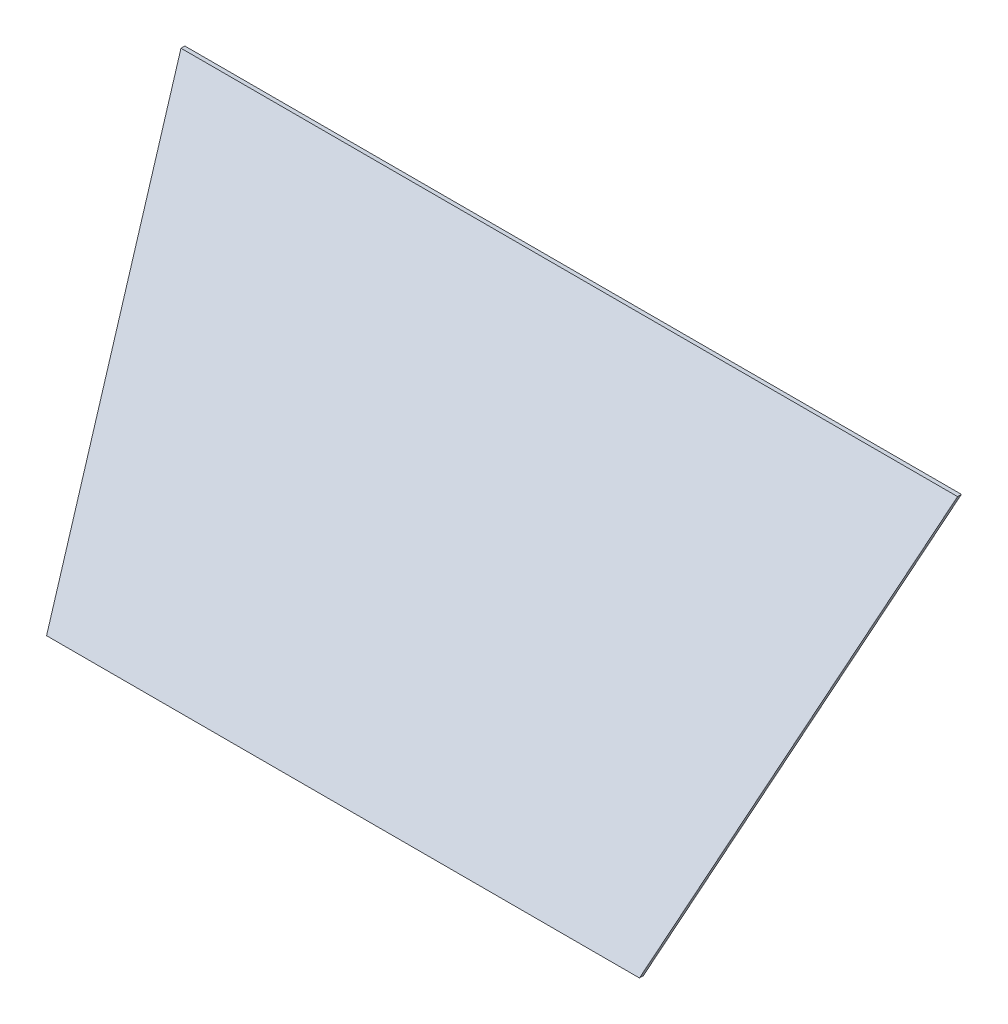
ISO-10303-21;
HEADER;
FILE_DESCRIPTION(('STEP AP214'),'2;1');
FILE_NAME('part.step','',(''),(''),'','','');
FILE_SCHEMA(('AUTOMOTIVE_DESIGN { 1 0 10303 214 1 1 1 1 }'));
ENDSEC;
DATA;
#1=APPLICATION_CONTEXT('core data for automotive mechanical design processes');
#2=APPLICATION_PROTOCOL_DEFINITION('international standard','automotive_design',2000,#1);
#3=PRODUCT_CONTEXT('',#1,'mechanical');
#4=PRODUCT('Part','Part','',(#3));
#5=PRODUCT_RELATED_PRODUCT_CATEGORY('part','',(#4));
#6=PRODUCT_DEFINITION_FORMATION('','',#4);
#7=PRODUCT_DEFINITION_CONTEXT('part definition',#1,'design');
#8=PRODUCT_DEFINITION('design','',#6,#7);
#9=PRODUCT_DEFINITION_SHAPE('','',#8);
#10=(LENGTH_UNIT() NAMED_UNIT(*) SI_UNIT(.MILLI.,.METRE.));
#11=(NAMED_UNIT(*) PLANE_ANGLE_UNIT() SI_UNIT($,.RADIAN.));
#12=(NAMED_UNIT(*) SI_UNIT($,.STERADIAN.) SOLID_ANGLE_UNIT());
#13=UNCERTAINTY_MEASURE_WITH_UNIT(LENGTH_MEASURE(1.E-05),#10,'distance_accuracy_value','');
#14=(GEOMETRIC_REPRESENTATION_CONTEXT(3) GLOBAL_UNCERTAINTY_ASSIGNED_CONTEXT((#13)) GLOBAL_UNIT_ASSIGNED_CONTEXT((#10,
#11,#12)) REPRESENTATION_CONTEXT('',''));
#15=CARTESIAN_POINT('',(0.,0.,0.));
#16=DIRECTION('',(0.,0.,1.));
#17=DIRECTION('',(1.,0.,0.));
#18=AXIS2_PLACEMENT_3D('',#15,#16,#17);
#19=CARTESIAN_POINT('',(0.,-529.718389738212,-815.684849984326));
#20=DIRECTION('',(0.,-0.543237640367641,-0.839578981447128));
#21=DIRECTION('',(0.,0.839578981447128,-0.543237640367641));
#22=AXIS2_PLACEMENT_3D('',#19,#20,#21);
#23=PLANE('',#22);
#24=DIRECTION('',(0.215350421936689,0.819879803707945,-0.530491567551749));
#25=VECTOR('',#24,1.);
#26=CARTESIAN_POINT('',(230.,94.9999999999997,-1219.9));
#27=LINE('',#26,#25);
#28=CARTESIAN_POINT('',(230.,94.9999999999997,-1219.9));
#29=VERTEX_POINT('',#28);
#30=CARTESIAN_POINT('',(301.265855838461,366.322597701217,-1395.45542838814));
#31=VERTEX_POINT('',#30);
#32=EDGE_CURVE('E95',#29,#31,#27,.T.);
#33=ORIENTED_EDGE('',*,*,#32,.T.);
#34=DIRECTION('',(1.,0.,0.));
#35=VECTOR('',#34,1.);
#36=CARTESIAN_POINT('',(-301.265855838461,366.322597701217,-1395.45542838814));
#37=LINE('',#36,#35);
#38=CARTESIAN_POINT('',(-301.265855838461,366.322597701217,-1395.45542838814));
#39=VERTEX_POINT('',#38);
#40=EDGE_CURVE('E101',#39,#31,#37,.T.);
#41=ORIENTED_EDGE('',*,*,#40,.F.);
#42=DIRECTION('',(-0.215350421936689,0.819879803707945,-0.530491567551749));
#43=VECTOR('',#42,1.);
#44=CARTESIAN_POINT('',(-230.,94.9999999999997,-1219.9));
#45=LINE('',#44,#43);
#46=CARTESIAN_POINT('',(-230.,94.9999999999997,-1219.9));
#47=VERTEX_POINT('',#46);
#48=EDGE_CURVE('E125',#47,#39,#45,.T.);
#49=ORIENTED_EDGE('',*,*,#48,.F.);
#50=DIRECTION('',(-1.,0.,0.));
#51=VECTOR('',#50,1.);
#52=CARTESIAN_POINT('',(230.,94.9999999999997,-1219.9));
#53=LINE('',#52,#51);
#54=EDGE_CURVE('E75',#29,#47,#53,.T.);
#55=ORIENTED_EDGE('',*,*,#54,.F.);
#56=EDGE_LOOP('',(#33,#41,#49,#55));
#57=FACE_BOUND('',#56,.T.);
#58=ADVANCED_FACE('F66',(#57),#23,.F.);
#59=CARTESIAN_POINT('',(0.,-529.718389738212,-818.684849984326));
#60=DIRECTION('',(0.,-0.543237640367641,-0.839578981447128));
#61=DIRECTION('',(0.,0.839578981447128,-0.543237640367641));
#62=AXIS2_PLACEMENT_3D('',#59,#60,#61);
#63=PLANE('',#62);
#64=DIRECTION('',(0.215350421936689,0.819879803707945,-0.530491567551749));
#65=VECTOR('',#64,1.);
#66=CARTESIAN_POINT('',(230.,94.9999999999997,-1222.9));
#67=LINE('',#66,#65);
#68=CARTESIAN_POINT('',(230.,94.9999999999997,-1222.9));
#69=VERTEX_POINT('',#68);
#70=CARTESIAN_POINT('',(301.265855838461,366.322597701217,-1398.45542838814));
#71=VERTEX_POINT('',#70);
#72=EDGE_CURVE('E83',#69,#71,#67,.T.);
#73=ORIENTED_EDGE('',*,*,#72,.F.);
#74=DIRECTION('',(-1.,0.,0.));
#75=VECTOR('',#74,1.);
#76=CARTESIAN_POINT('',(230.,94.9999999999997,-1222.9));
#77=LINE('',#76,#75);
#78=CARTESIAN_POINT('',(-230.,94.9999999999997,-1222.9));
#79=VERTEX_POINT('',#78);
#80=EDGE_CURVE('E12',#69,#79,#77,.T.);
#81=ORIENTED_EDGE('',*,*,#80,.T.);
#82=DIRECTION('',(-0.215350421936689,0.819879803707945,-0.530491567551749));
#83=VECTOR('',#82,1.);
#84=CARTESIAN_POINT('',(-230.,94.9999999999997,-1222.9));
#85=LINE('',#84,#83);
#86=CARTESIAN_POINT('',(-301.265855838461,366.322597701217,-1398.45542838814));
#87=VERTEX_POINT('',#86);
#88=EDGE_CURVE('E110',#79,#87,#85,.T.);
#89=ORIENTED_EDGE('',*,*,#88,.T.);
#90=DIRECTION('',(1.,0.,0.));
#91=VECTOR('',#90,1.);
#92=CARTESIAN_POINT('',(-301.265855838461,366.322597701217,-1398.45542838814));
#93=LINE('',#92,#91);
#94=EDGE_CURVE('E127',#87,#71,#93,.T.);
#95=ORIENTED_EDGE('',*,*,#94,.T.);
#96=EDGE_LOOP('',(#73,#81,#89,#95));
#97=FACE_BOUND('',#96,.T.);
#98=ADVANCED_FACE('F109',(#97),#63,.T.);
#99=CARTESIAN_POINT('',(230.,94.9999999999997,-1222.9));
#100=DIRECTION('',(0.967192721346285,-0.254043775311987,0.));
#101=DIRECTION('',(0.254043775311987,0.967192721346285,0.));
#102=AXIS2_PLACEMENT_3D('',#99,#100,#101);
#103=PLANE('',#102);
#104=ORIENTED_EDGE('',*,*,#32,.F.);
#105=DIRECTION('',(0.,0.,1.));
#106=VECTOR('',#105,1.);
#107=CARTESIAN_POINT('',(230.,94.9999999999997,-1222.9));
#108=LINE('',#107,#106);
#109=EDGE_CURVE('E138',#69,#29,#108,.T.);
#110=ORIENTED_EDGE('',*,*,#109,.F.);
#111=ORIENTED_EDGE('',*,*,#72,.T.);
#112=DIRECTION('',(0.,0.,1.));
#113=VECTOR('',#112,1.);
#114=CARTESIAN_POINT('',(301.265855838461,366.322597701217,-1398.45542838814));
#115=LINE('',#114,#113);
#116=EDGE_CURVE('E150',#71,#31,#115,.T.);
#117=ORIENTED_EDGE('',*,*,#116,.T.);
#118=EDGE_LOOP('',(#104,#110,#111,#117));
#119=FACE_BOUND('',#118,.T.);
#120=ADVANCED_FACE('F162',(#119),#103,.T.);
#121=CARTESIAN_POINT('',(230.,94.9999999999997,-1222.9));
#122=DIRECTION('',(0.,1.,0.));
#123=DIRECTION('',(0.,0.,1.));
#124=AXIS2_PLACEMENT_3D('',#121,#122,#123);
#125=PLANE('',#124);
#126=ORIENTED_EDGE('',*,*,#54,.T.);
#127=DIRECTION('',(0.,0.,1.));
#128=VECTOR('',#127,1.);
#129=CARTESIAN_POINT('',(-230.,94.9999999999997,-1222.9));
#130=LINE('',#129,#128);
#131=EDGE_CURVE('E120',#79,#47,#130,.T.);
#132=ORIENTED_EDGE('',*,*,#131,.F.);
#133=ORIENTED_EDGE('',*,*,#80,.F.);
#134=ORIENTED_EDGE('',*,*,#109,.T.);
#135=EDGE_LOOP('',(#126,#132,#133,#134));
#136=FACE_BOUND('',#135,.T.);
#137=ADVANCED_FACE('F124',(#136),#125,.F.);
#138=CARTESIAN_POINT('',(-230.,94.9999999999997,-1222.9));
#139=DIRECTION('',(0.967192721346285,0.254043775311987,0.));
#140=DIRECTION('',(-0.254043775311987,0.967192721346285,0.));
#141=AXIS2_PLACEMENT_3D('',#138,#139,#140);
#142=PLANE('',#141);
#143=ORIENTED_EDGE('',*,*,#48,.T.);
#144=DIRECTION('',(0.,0.,1.));
#145=VECTOR('',#144,1.);
#146=CARTESIAN_POINT('',(-301.265855838461,366.322597701217,-1398.45542838814));
#147=LINE('',#146,#145);
#148=EDGE_CURVE('E122',#87,#39,#147,.T.);
#149=ORIENTED_EDGE('',*,*,#148,.F.);
#150=ORIENTED_EDGE('',*,*,#88,.F.);
#151=ORIENTED_EDGE('',*,*,#131,.T.);
#152=EDGE_LOOP('',(#143,#149,#150,#151));
#153=FACE_BOUND('',#152,.T.);
#154=ADVANCED_FACE('F119',(#153),#142,.F.);
#155=CARTESIAN_POINT('',(-301.265855838461,366.322597701217,-1398.45542838814));
#156=DIRECTION('',(0.,-1.,0.));
#157=DIRECTION('',(0.,0.,-1.));
#158=AXIS2_PLACEMENT_3D('',#155,#156,#157);
#159=PLANE('',#158);
#160=ORIENTED_EDGE('',*,*,#40,.T.);
#161=ORIENTED_EDGE('',*,*,#116,.F.);
#162=ORIENTED_EDGE('',*,*,#94,.F.);
#163=ORIENTED_EDGE('',*,*,#148,.T.);
#164=EDGE_LOOP('',(#160,#161,#162,#163));
#165=FACE_BOUND('',#164,.T.);
#166=ADVANCED_FACE('F171',(#165),#159,.F.);
#167=CLOSED_SHELL('',(#58,#98,#120,#137,#154,#166));
#168=MANIFOLD_SOLID_BREP('B2',#167);
#169=ADVANCED_BREP_SHAPE_REPRESENTATION('',(#18,#168),#14);
#170=SHAPE_DEFINITION_REPRESENTATION(#9,#169);
ENDSEC;
END-ISO-10303-21;
